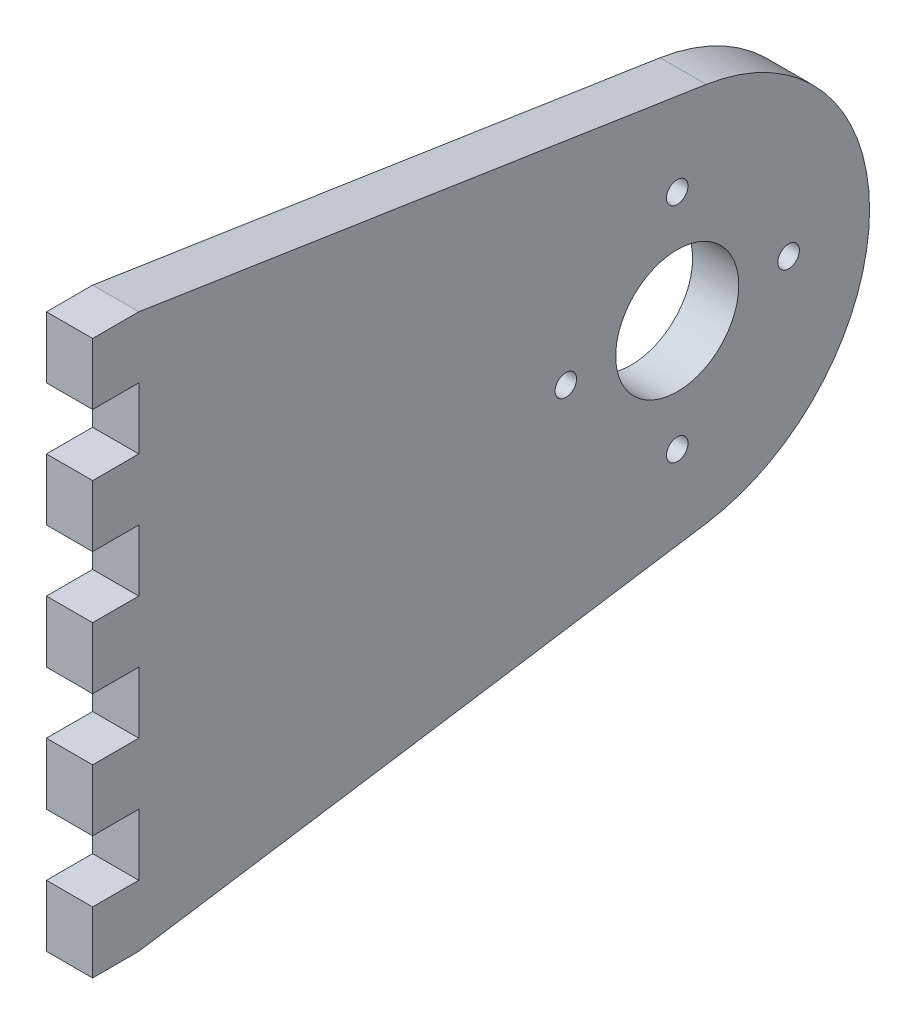
ISO-10303-21;
HEADER;
FILE_DESCRIPTION(('STEP AP214'),'2;1');
FILE_NAME('part.step','',(''),(''),'','','');
FILE_SCHEMA(('AUTOMOTIVE_DESIGN { 1 0 10303 214 1 1 1 1 }'));
ENDSEC;
DATA;
#1=APPLICATION_CONTEXT('core data for automotive mechanical design processes');
#2=APPLICATION_PROTOCOL_DEFINITION('international standard','automotive_design',2000,#1);
#3=PRODUCT_CONTEXT('',#1,'mechanical');
#4=PRODUCT('Part','Part','',(#3));
#5=PRODUCT_RELATED_PRODUCT_CATEGORY('part','',(#4));
#6=PRODUCT_DEFINITION_FORMATION('','',#4);
#7=PRODUCT_DEFINITION_CONTEXT('part definition',#1,'design');
#8=PRODUCT_DEFINITION('design','',#6,#7);
#9=PRODUCT_DEFINITION_SHAPE('','',#8);
#10=(LENGTH_UNIT() NAMED_UNIT(*) SI_UNIT(.MILLI.,.METRE.));
#11=(NAMED_UNIT(*) PLANE_ANGLE_UNIT() SI_UNIT($,.RADIAN.));
#12=(NAMED_UNIT(*) SI_UNIT($,.STERADIAN.) SOLID_ANGLE_UNIT());
#13=UNCERTAINTY_MEASURE_WITH_UNIT(LENGTH_MEASURE(1.E-05),#10,'distance_accuracy_value','');
#14=(GEOMETRIC_REPRESENTATION_CONTEXT(3) GLOBAL_UNCERTAINTY_ASSIGNED_CONTEXT((#13)) GLOBAL_UNIT_ASSIGNED_CONTEXT((#10,
#11,#12)) REPRESENTATION_CONTEXT('',''));
#15=CARTESIAN_POINT('',(0.,0.,0.));
#16=DIRECTION('',(0.,0.,1.));
#17=DIRECTION('',(1.,0.,0.));
#18=AXIS2_PLACEMENT_3D('',#15,#16,#17);
#19=CARTESIAN_POINT('',(3.,0.,0.));
#20=DIRECTION('',(1.,0.,0.));
#21=DIRECTION('',(0.,0.,-1.));
#22=AXIS2_PLACEMENT_3D('',#19,#20,#21);
#23=PLANE('',#22);
#24=CARTESIAN_POINT('',(3.,0.,-7.24));
#25=DIRECTION('',(1.,0.,0.));
#26=DIRECTION('',(0.,0.,-1.));
#27=AXIS2_PLACEMENT_3D('',#24,#25,#26);
#28=CIRCLE('',#27,0.700000000000001);
#29=CARTESIAN_POINT('',(3.,0.,-7.94));
#30=VERTEX_POINT('',#29);
#31=EDGE_CURVE('E426',#30,#30,#28,.T.);
#32=ORIENTED_EDGE('',*,*,#31,.F.);
#33=EDGE_LOOP('',(#32));
#34=FACE_BOUND('',#33,.T.);
#35=CARTESIAN_POINT('',(3.,0.,7.24));
#36=DIRECTION('',(1.,0.,0.));
#37=DIRECTION('',(0.,0.,-1.));
#38=AXIS2_PLACEMENT_3D('',#35,#36,#37);
#39=CIRCLE('',#38,0.7);
#40=CARTESIAN_POINT('',(3.,0.,6.54));
#41=VERTEX_POINT('',#40);
#42=EDGE_CURVE('E438',#41,#41,#39,.T.);
#43=ORIENTED_EDGE('',*,*,#42,.F.);
#44=EDGE_LOOP('',(#43));
#45=FACE_BOUND('',#44,.T.);
#46=DIRECTION('',(0.,0.,-1.));
#47=VECTOR('',#46,1.);
#48=CARTESIAN_POINT('',(3.,14.,38.));
#49=LINE('',#48,#47);
#50=CARTESIAN_POINT('',(3.,14.,38.));
#51=VERTEX_POINT('',#50);
#52=CARTESIAN_POINT('',(3.,14.,35.));
#53=VERTEX_POINT('',#52);
#54=EDGE_CURVE('E257',#51,#53,#49,.T.);
#55=ORIENTED_EDGE('',*,*,#54,.T.);
#56=DIRECTION('',(0.,-1.,0.));
#57=VECTOR('',#56,1.);
#58=CARTESIAN_POINT('',(3.,14.,35.));
#59=LINE('',#58,#57);
#60=CARTESIAN_POINT('',(3.,10.,35.));
#61=VERTEX_POINT('',#60);
#62=EDGE_CURVE('E135',#53,#61,#59,.T.);
#63=ORIENTED_EDGE('',*,*,#62,.T.);
#64=DIRECTION('',(0.,0.,1.));
#65=VECTOR('',#64,1.);
#66=CARTESIAN_POINT('',(3.,10.,35.));
#67=LINE('',#66,#65);
#68=CARTESIAN_POINT('',(3.,10.,38.));
#69=VERTEX_POINT('',#68);
#70=EDGE_CURVE('E314',#61,#69,#67,.T.);
#71=ORIENTED_EDGE('',*,*,#70,.T.);
#72=DIRECTION('',(0.,-1.,0.));
#73=VECTOR('',#72,1.);
#74=CARTESIAN_POINT('',(3.,10.,38.));
#75=LINE('',#74,#73);
#76=CARTESIAN_POINT('',(3.,6.,38.));
#77=VERTEX_POINT('',#76);
#78=EDGE_CURVE('E333',#69,#77,#75,.T.);
#79=ORIENTED_EDGE('',*,*,#78,.T.);
#80=DIRECTION('',(0.,0.,-1.));
#81=VECTOR('',#80,1.);
#82=CARTESIAN_POINT('',(3.,6.,38.));
#83=LINE('',#82,#81);
#84=CARTESIAN_POINT('',(3.,6.,35.));
#85=VERTEX_POINT('',#84);
#86=EDGE_CURVE('E330',#77,#85,#83,.T.);
#87=ORIENTED_EDGE('',*,*,#86,.T.);
#88=DIRECTION('',(0.,-1.,0.));
#89=VECTOR('',#88,1.);
#90=CARTESIAN_POINT('',(3.,6.,35.));
#91=LINE('',#90,#89);
#92=CARTESIAN_POINT('',(3.,2.,35.));
#93=VERTEX_POINT('',#92);
#94=EDGE_CURVE('E332',#85,#93,#91,.T.);
#95=ORIENTED_EDGE('',*,*,#94,.T.);
#96=DIRECTION('',(0.,0.,1.));
#97=VECTOR('',#96,1.);
#98=CARTESIAN_POINT('',(3.,2.,35.));
#99=LINE('',#98,#97);
#100=CARTESIAN_POINT('',(3.,2.,38.));
#101=VERTEX_POINT('',#100);
#102=EDGE_CURVE('E335',#93,#101,#99,.T.);
#103=ORIENTED_EDGE('',*,*,#102,.T.);
#104=DIRECTION('',(0.,-1.,0.));
#105=VECTOR('',#104,1.);
#106=CARTESIAN_POINT('',(3.,2.,38.));
#107=LINE('',#106,#105);
#108=CARTESIAN_POINT('',(3.,-2.,38.));
#109=VERTEX_POINT('',#108);
#110=EDGE_CURVE('E341',#101,#109,#107,.T.);
#111=ORIENTED_EDGE('',*,*,#110,.T.);
#112=DIRECTION('',(0.,0.,-1.));
#113=VECTOR('',#112,1.);
#114=CARTESIAN_POINT('',(3.,-2.,35.));
#115=LINE('',#114,#113);
#116=CARTESIAN_POINT('',(3.,-2.,35.));
#117=VERTEX_POINT('',#116);
#118=EDGE_CURVE('E343',#109,#117,#115,.T.);
#119=ORIENTED_EDGE('',*,*,#118,.T.);
#120=DIRECTION('',(0.,-1.,0.));
#121=VECTOR('',#120,1.);
#122=CARTESIAN_POINT('',(3.,-6.,35.));
#123=LINE('',#122,#121);
#124=CARTESIAN_POINT('',(3.,-6.,35.));
#125=VERTEX_POINT('',#124);
#126=EDGE_CURVE('E345',#117,#125,#123,.T.);
#127=ORIENTED_EDGE('',*,*,#126,.T.);
#128=DIRECTION('',(0.,0.,1.));
#129=VECTOR('',#128,1.);
#130=CARTESIAN_POINT('',(3.,-6.,38.));
#131=LINE('',#130,#129);
#132=CARTESIAN_POINT('',(3.,-6.,38.));
#133=VERTEX_POINT('',#132);
#134=EDGE_CURVE('E347',#125,#133,#131,.T.);
#135=ORIENTED_EDGE('',*,*,#134,.T.);
#136=DIRECTION('',(0.,-1.,0.));
#137=VECTOR('',#136,1.);
#138=CARTESIAN_POINT('',(3.,-6.,38.));
#139=LINE('',#138,#137);
#140=CARTESIAN_POINT('',(3.,-10.,38.));
#141=VERTEX_POINT('',#140);
#142=EDGE_CURVE('E349',#133,#141,#139,.T.);
#143=ORIENTED_EDGE('',*,*,#142,.T.);
#144=DIRECTION('',(0.,0.,-1.));
#145=VECTOR('',#144,1.);
#146=CARTESIAN_POINT('',(3.,-10.,35.));
#147=LINE('',#146,#145);
#148=CARTESIAN_POINT('',(3.,-10.,35.));
#149=VERTEX_POINT('',#148);
#150=EDGE_CURVE('E351',#141,#149,#147,.T.);
#151=ORIENTED_EDGE('',*,*,#150,.T.);
#152=DIRECTION('',(0.,-1.,0.));
#153=VECTOR('',#152,1.);
#154=CARTESIAN_POINT('',(3.,-14.,35.));
#155=LINE('',#154,#153);
#156=CARTESIAN_POINT('',(3.,-14.,35.));
#157=VERTEX_POINT('',#156);
#158=EDGE_CURVE('E353',#149,#157,#155,.T.);
#159=ORIENTED_EDGE('',*,*,#158,.T.);
#160=DIRECTION('',(0.,0.,1.));
#161=VECTOR('',#160,1.);
#162=CARTESIAN_POINT('',(3.,-14.,38.));
#163=LINE('',#162,#161);
#164=CARTESIAN_POINT('',(3.,-14.,38.));
#165=VERTEX_POINT('',#164);
#166=EDGE_CURVE('E355',#157,#165,#163,.T.);
#167=ORIENTED_EDGE('',*,*,#166,.T.);
#168=DIRECTION('',(0.,-1.,0.));
#169=VECTOR('',#168,1.);
#170=CARTESIAN_POINT('',(3.,-14.,38.));
#171=LINE('',#170,#169);
#172=CARTESIAN_POINT('',(3.,-18.,38.));
#173=VERTEX_POINT('',#172);
#174=EDGE_CURVE('E357',#165,#173,#171,.T.);
#175=ORIENTED_EDGE('',*,*,#174,.T.);
#176=DIRECTION('',(0.,0.,-1.));
#177=VECTOR('',#176,1.);
#178=CARTESIAN_POINT('',(3.,-18.,38.));
#179=LINE('',#178,#177);
#180=CARTESIAN_POINT('',(3.,-18.,35.));
#181=VERTEX_POINT('',#180);
#182=EDGE_CURVE('E359',#173,#181,#179,.T.);
#183=ORIENTED_EDGE('',*,*,#182,.T.);
#184=DIRECTION('',(0.,0.151228009328428,-0.988498907027499));
#185=VECTOR('',#184,1.);
#186=CARTESIAN_POINT('',(3.,-18.,35.));
#187=LINE('',#186,#185);
#188=CARTESIAN_POINT('',(3.,-12.3562363378437,-1.89035011660535));
#189=VERTEX_POINT('',#188);
#190=EDGE_CURVE('E361',#181,#189,#187,.T.);
#191=ORIENTED_EDGE('',*,*,#190,.T.);
#192=CARTESIAN_POINT('',(3.,0.,0.));
#193=DIRECTION('',(1.,0.,0.));
#194=DIRECTION('',(0.,0.,-1.));
#195=AXIS2_PLACEMENT_3D('',#192,#193,#194);
#196=CIRCLE('',#195,12.5);
#197=CARTESIAN_POINT('',(3.,12.3562363378437,-1.89035011660535));
#198=VERTEX_POINT('',#197);
#199=EDGE_CURVE('E196',#189,#198,#196,.T.);
#200=ORIENTED_EDGE('',*,*,#199,.T.);
#201=DIRECTION('',(0.,0.151228009328428,0.988498907027499));
#202=VECTOR('',#201,1.);
#203=CARTESIAN_POINT('',(3.,18.,35.));
#204=LINE('',#203,#202);
#205=CARTESIAN_POINT('',(3.,18.,35.));
#206=VERTEX_POINT('',#205);
#207=EDGE_CURVE('E190',#198,#206,#204,.T.);
#208=ORIENTED_EDGE('',*,*,#207,.T.);
#209=DIRECTION('',(0.,0.,1.));
#210=VECTOR('',#209,1.);
#211=CARTESIAN_POINT('',(3.,18.,38.));
#212=LINE('',#211,#210);
#213=CARTESIAN_POINT('',(3.,18.,38.));
#214=VERTEX_POINT('',#213);
#215=EDGE_CURVE('E194',#206,#214,#212,.T.);
#216=ORIENTED_EDGE('',*,*,#215,.T.);
#217=DIRECTION('',(0.,-1.,0.));
#218=VECTOR('',#217,1.);
#219=CARTESIAN_POINT('',(3.,18.,38.));
#220=LINE('',#219,#218);
#221=EDGE_CURVE('E50',#214,#51,#220,.T.);
#222=ORIENTED_EDGE('',*,*,#221,.T.);
#223=EDGE_LOOP('',(#55,#63,#71,#79,#87,#95,#103,#111,#119,#127,#135,#143,#151,#159,#167,#175,
#183,#191,#200,#208,#216,#222));
#224=FACE_BOUND('',#223,.T.);
#225=CARTESIAN_POINT('',(3.,0.,0.));
#226=DIRECTION('',(1.,0.,0.));
#227=DIRECTION('',(0.,0.,-1.));
#228=AXIS2_PLACEMENT_3D('',#225,#226,#227);
#229=CIRCLE('',#228,4.);
#230=CARTESIAN_POINT('',(3.,0.,-4.));
#231=VERTEX_POINT('',#230);
#232=EDGE_CURVE('E218',#231,#231,#229,.T.);
#233=ORIENTED_EDGE('',*,*,#232,.F.);
#234=EDGE_LOOP('',(#233));
#235=FACE_BOUND('',#234,.T.);
#236=CARTESIAN_POINT('',(3.,7.24,0.));
#237=DIRECTION('',(1.,0.,0.));
#238=DIRECTION('',(0.,0.,-1.));
#239=AXIS2_PLACEMENT_3D('',#236,#237,#238);
#240=CIRCLE('',#239,0.7);
#241=CARTESIAN_POINT('',(3.,7.24,-0.699999999999999));
#242=VERTEX_POINT('',#241);
#243=EDGE_CURVE('E432',#242,#242,#240,.T.);
#244=ORIENTED_EDGE('',*,*,#243,.F.);
#245=EDGE_LOOP('',(#244));
#246=FACE_BOUND('',#245,.T.);
#247=CARTESIAN_POINT('',(3.,-7.24,0.));
#248=DIRECTION('',(1.,0.,0.));
#249=DIRECTION('',(0.,0.,-1.));
#250=AXIS2_PLACEMENT_3D('',#247,#248,#249);
#251=CIRCLE('',#250,0.7);
#252=CARTESIAN_POINT('',(3.,-7.24,-0.700000000000001));
#253=VERTEX_POINT('',#252);
#254=EDGE_CURVE('E417',#253,#253,#251,.T.);
#255=ORIENTED_EDGE('',*,*,#254,.F.);
#256=EDGE_LOOP('',(#255));
#257=FACE_BOUND('',#256,.T.);
#258=ADVANCED_FACE('F33',(#34,#45,#224,#235,#246,#257),#23,.T.);
#259=CARTESIAN_POINT('',(0.,0.,0.));
#260=DIRECTION('',(1.,0.,0.));
#261=DIRECTION('',(0.,0.,-1.));
#262=AXIS2_PLACEMENT_3D('',#259,#260,#261);
#263=PLANE('',#262);
#264=CARTESIAN_POINT('',(0.,0.,-7.24));
#265=DIRECTION('',(1.,0.,0.));
#266=DIRECTION('',(0.,0.,-1.));
#267=AXIS2_PLACEMENT_3D('',#264,#265,#266);
#268=CIRCLE('',#267,0.700000000000001);
#269=CARTESIAN_POINT('',(0.,0.,-7.94));
#270=VERTEX_POINT('',#269);
#271=EDGE_CURVE('E423',#270,#270,#268,.T.);
#272=ORIENTED_EDGE('',*,*,#271,.T.);
#273=EDGE_LOOP('',(#272));
#274=FACE_BOUND('',#273,.T.);
#275=CARTESIAN_POINT('',(0.,0.,7.24));
#276=DIRECTION('',(1.,0.,0.));
#277=DIRECTION('',(0.,0.,-1.));
#278=AXIS2_PLACEMENT_3D('',#275,#276,#277);
#279=CIRCLE('',#278,0.7);
#280=CARTESIAN_POINT('',(0.,0.,6.54));
#281=VERTEX_POINT('',#280);
#282=EDGE_CURVE('E435',#281,#281,#279,.T.);
#283=ORIENTED_EDGE('',*,*,#282,.T.);
#284=EDGE_LOOP('',(#283));
#285=FACE_BOUND('',#284,.T.);
#286=DIRECTION('',(0.,0.,-1.));
#287=VECTOR('',#286,1.);
#288=CARTESIAN_POINT('',(0.,14.,38.));
#289=LINE('',#288,#287);
#290=CARTESIAN_POINT('',(0.,14.,38.));
#291=VERTEX_POINT('',#290);
#292=CARTESIAN_POINT('',(0.,14.,35.));
#293=VERTEX_POINT('',#292);
#294=EDGE_CURVE('E214',#291,#293,#289,.T.);
#295=ORIENTED_EDGE('',*,*,#294,.F.);
#296=DIRECTION('',(0.,-1.,0.));
#297=VECTOR('',#296,1.);
#298=CARTESIAN_POINT('',(0.,18.,38.));
#299=LINE('',#298,#297);
#300=CARTESIAN_POINT('',(0.,18.,38.));
#301=VERTEX_POINT('',#300);
#302=EDGE_CURVE('E127',#301,#291,#299,.T.);
#303=ORIENTED_EDGE('',*,*,#302,.F.);
#304=DIRECTION('',(0.,0.,1.));
#305=VECTOR('',#304,1.);
#306=CARTESIAN_POINT('',(0.,18.,38.));
#307=LINE('',#306,#305);
#308=CARTESIAN_POINT('',(0.,18.,35.));
#309=VERTEX_POINT('',#308);
#310=EDGE_CURVE('E121',#309,#301,#307,.T.);
#311=ORIENTED_EDGE('',*,*,#310,.F.);
#312=DIRECTION('',(0.,0.151228009328428,0.988498907027499));
#313=VECTOR('',#312,1.);
#314=CARTESIAN_POINT('',(0.,18.,35.));
#315=LINE('',#314,#313);
#316=CARTESIAN_POINT('',(0.,12.3562363378437,-1.89035011660535));
#317=VERTEX_POINT('',#316);
#318=EDGE_CURVE('E204',#317,#309,#315,.T.);
#319=ORIENTED_EDGE('',*,*,#318,.F.);
#320=CARTESIAN_POINT('',(0.,0.,0.));
#321=DIRECTION('',(1.,0.,0.));
#322=DIRECTION('',(0.,0.,-1.));
#323=AXIS2_PLACEMENT_3D('',#320,#321,#322);
#324=CIRCLE('',#323,12.5);
#325=CARTESIAN_POINT('',(0.,-12.3562363378437,-1.89035011660535));
#326=VERTEX_POINT('',#325);
#327=EDGE_CURVE('E252',#326,#317,#324,.T.);
#328=ORIENTED_EDGE('',*,*,#327,.F.);
#329=DIRECTION('',(0.,0.151228009328428,-0.988498907027499));
#330=VECTOR('',#329,1.);
#331=CARTESIAN_POINT('',(0.,-18.,35.));
#332=LINE('',#331,#330);
#333=CARTESIAN_POINT('',(0.,-18.,35.));
#334=VERTEX_POINT('',#333);
#335=EDGE_CURVE('E250',#334,#326,#332,.T.);
#336=ORIENTED_EDGE('',*,*,#335,.F.);
#337=DIRECTION('',(0.,0.,-1.));
#338=VECTOR('',#337,1.);
#339=CARTESIAN_POINT('',(0.,-18.,38.));
#340=LINE('',#339,#338);
#341=CARTESIAN_POINT('',(0.,-18.,38.));
#342=VERTEX_POINT('',#341);
#343=EDGE_CURVE('E248',#342,#334,#340,.T.);
#344=ORIENTED_EDGE('',*,*,#343,.F.);
#345=DIRECTION('',(0.,-1.,0.));
#346=VECTOR('',#345,1.);
#347=CARTESIAN_POINT('',(0.,-14.,38.));
#348=LINE('',#347,#346);
#349=CARTESIAN_POINT('',(0.,-14.,38.));
#350=VERTEX_POINT('',#349);
#351=EDGE_CURVE('E246',#350,#342,#348,.T.);
#352=ORIENTED_EDGE('',*,*,#351,.F.);
#353=DIRECTION('',(0.,0.,1.));
#354=VECTOR('',#353,1.);
#355=CARTESIAN_POINT('',(0.,-14.,38.));
#356=LINE('',#355,#354);
#357=CARTESIAN_POINT('',(0.,-14.,35.));
#358=VERTEX_POINT('',#357);
#359=EDGE_CURVE('E244',#358,#350,#356,.T.);
#360=ORIENTED_EDGE('',*,*,#359,.F.);
#361=DIRECTION('',(0.,-1.,0.));
#362=VECTOR('',#361,1.);
#363=CARTESIAN_POINT('',(0.,-14.,35.));
#364=LINE('',#363,#362);
#365=CARTESIAN_POINT('',(0.,-10.,35.));
#366=VERTEX_POINT('',#365);
#367=EDGE_CURVE('E242',#366,#358,#364,.T.);
#368=ORIENTED_EDGE('',*,*,#367,.F.);
#369=DIRECTION('',(0.,0.,-1.));
#370=VECTOR('',#369,1.);
#371=CARTESIAN_POINT('',(0.,-10.,35.));
#372=LINE('',#371,#370);
#373=CARTESIAN_POINT('',(0.,-10.,38.));
#374=VERTEX_POINT('',#373);
#375=EDGE_CURVE('E240',#374,#366,#372,.T.);
#376=ORIENTED_EDGE('',*,*,#375,.F.);
#377=DIRECTION('',(0.,-1.,0.));
#378=VECTOR('',#377,1.);
#379=CARTESIAN_POINT('',(0.,-6.,38.));
#380=LINE('',#379,#378);
#381=CARTESIAN_POINT('',(0.,-6.,38.));
#382=VERTEX_POINT('',#381);
#383=EDGE_CURVE('E238',#382,#374,#380,.T.);
#384=ORIENTED_EDGE('',*,*,#383,.F.);
#385=DIRECTION('',(0.,0.,1.));
#386=VECTOR('',#385,1.);
#387=CARTESIAN_POINT('',(0.,-6.,38.));
#388=LINE('',#387,#386);
#389=CARTESIAN_POINT('',(0.,-6.,35.));
#390=VERTEX_POINT('',#389);
#391=EDGE_CURVE('E236',#390,#382,#388,.T.);
#392=ORIENTED_EDGE('',*,*,#391,.F.);
#393=DIRECTION('',(0.,-1.,0.));
#394=VECTOR('',#393,1.);
#395=CARTESIAN_POINT('',(0.,-6.,35.));
#396=LINE('',#395,#394);
#397=CARTESIAN_POINT('',(0.,-2.,35.));
#398=VERTEX_POINT('',#397);
#399=EDGE_CURVE('E234',#398,#390,#396,.T.);
#400=ORIENTED_EDGE('',*,*,#399,.F.);
#401=DIRECTION('',(0.,0.,-1.));
#402=VECTOR('',#401,1.);
#403=CARTESIAN_POINT('',(0.,-2.,35.));
#404=LINE('',#403,#402);
#405=CARTESIAN_POINT('',(0.,-2.,38.));
#406=VERTEX_POINT('',#405);
#407=EDGE_CURVE('E232',#406,#398,#404,.T.);
#408=ORIENTED_EDGE('',*,*,#407,.F.);
#409=DIRECTION('',(0.,-1.,0.));
#410=VECTOR('',#409,1.);
#411=CARTESIAN_POINT('',(0.,2.,38.));
#412=LINE('',#411,#410);
#413=CARTESIAN_POINT('',(0.,2.,38.));
#414=VERTEX_POINT('',#413);
#415=EDGE_CURVE('E230',#414,#406,#412,.T.);
#416=ORIENTED_EDGE('',*,*,#415,.F.);
#417=DIRECTION('',(0.,0.,1.));
#418=VECTOR('',#417,1.);
#419=CARTESIAN_POINT('',(0.,2.,35.));
#420=LINE('',#419,#418);
#421=CARTESIAN_POINT('',(0.,2.,35.));
#422=VERTEX_POINT('',#421);
#423=EDGE_CURVE('E228',#422,#414,#420,.T.);
#424=ORIENTED_EDGE('',*,*,#423,.F.);
#425=DIRECTION('',(0.,-1.,0.));
#426=VECTOR('',#425,1.);
#427=CARTESIAN_POINT('',(0.,6.,35.));
#428=LINE('',#427,#426);
#429=CARTESIAN_POINT('',(0.,6.,35.));
#430=VERTEX_POINT('',#429);
#431=EDGE_CURVE('E226',#430,#422,#428,.T.);
#432=ORIENTED_EDGE('',*,*,#431,.F.);
#433=DIRECTION('',(0.,0.,-1.));
#434=VECTOR('',#433,1.);
#435=CARTESIAN_POINT('',(0.,6.,38.));
#436=LINE('',#435,#434);
#437=CARTESIAN_POINT('',(0.,6.,38.));
#438=VERTEX_POINT('',#437);
#439=EDGE_CURVE('E224',#438,#430,#436,.T.);
#440=ORIENTED_EDGE('',*,*,#439,.F.);
#441=DIRECTION('',(0.,-1.,0.));
#442=VECTOR('',#441,1.);
#443=CARTESIAN_POINT('',(0.,10.,38.));
#444=LINE('',#443,#442);
#445=CARTESIAN_POINT('',(0.,10.,38.));
#446=VERTEX_POINT('',#445);
#447=EDGE_CURVE('E222',#446,#438,#444,.T.);
#448=ORIENTED_EDGE('',*,*,#447,.F.);
#449=DIRECTION('',(0.,0.,1.));
#450=VECTOR('',#449,1.);
#451=CARTESIAN_POINT('',(0.,10.,35.));
#452=LINE('',#451,#450);
#453=CARTESIAN_POINT('',(0.,10.,35.));
#454=VERTEX_POINT('',#453);
#455=EDGE_CURVE('E220',#454,#446,#452,.T.);
#456=ORIENTED_EDGE('',*,*,#455,.F.);
#457=DIRECTION('',(0.,-1.,0.));
#458=VECTOR('',#457,1.);
#459=CARTESIAN_POINT('',(0.,14.,35.));
#460=LINE('',#459,#458);
#461=EDGE_CURVE('E217',#293,#454,#460,.T.);
#462=ORIENTED_EDGE('',*,*,#461,.F.);
#463=EDGE_LOOP('',(#295,#303,#311,#319,#328,#336,#344,#352,#360,#368,#376,#384,#392,#400,#408,
#416,#424,#432,#440,#448,#456,#462));
#464=FACE_BOUND('',#463,.T.);
#465=CARTESIAN_POINT('',(0.,0.,0.));
#466=DIRECTION('',(1.,0.,0.));
#467=DIRECTION('',(0.,0.,-1.));
#468=AXIS2_PLACEMENT_3D('',#465,#466,#467);
#469=CIRCLE('',#468,4.);
#470=CARTESIAN_POINT('',(0.,0.,-4.));
#471=VERTEX_POINT('',#470);
#472=EDGE_CURVE('E441',#471,#471,#469,.T.);
#473=ORIENTED_EDGE('',*,*,#472,.T.);
#474=EDGE_LOOP('',(#473));
#475=FACE_BOUND('',#474,.T.);
#476=CARTESIAN_POINT('',(0.,7.24,0.));
#477=DIRECTION('',(1.,0.,0.));
#478=DIRECTION('',(0.,0.,-1.));
#479=AXIS2_PLACEMENT_3D('',#476,#477,#478);
#480=CIRCLE('',#479,0.7);
#481=CARTESIAN_POINT('',(0.,7.24,-0.699999999999999));
#482=VERTEX_POINT('',#481);
#483=EDGE_CURVE('E429',#482,#482,#480,.T.);
#484=ORIENTED_EDGE('',*,*,#483,.T.);
#485=EDGE_LOOP('',(#484));
#486=FACE_BOUND('',#485,.T.);
#487=CARTESIAN_POINT('',(0.,-7.24,0.));
#488=DIRECTION('',(1.,0.,0.));
#489=DIRECTION('',(0.,0.,-1.));
#490=AXIS2_PLACEMENT_3D('',#487,#488,#489);
#491=CIRCLE('',#490,0.7);
#492=CARTESIAN_POINT('',(0.,-7.24,-0.700000000000001));
#493=VERTEX_POINT('',#492);
#494=EDGE_CURVE('E420',#493,#493,#491,.T.);
#495=ORIENTED_EDGE('',*,*,#494,.T.);
#496=EDGE_LOOP('',(#495));
#497=FACE_BOUND('',#496,.T.);
#498=ADVANCED_FACE('F318',(#274,#285,#464,#475,#486,#497),#263,.F.);
#499=CARTESIAN_POINT('',(3.,14.,38.));
#500=DIRECTION('',(0.,1.,0.));
#501=DIRECTION('',(0.,0.,1.));
#502=AXIS2_PLACEMENT_3D('',#499,#500,#501);
#503=PLANE('',#502);
#504=ORIENTED_EDGE('',*,*,#294,.T.);
#505=DIRECTION('',(-1.,0.,0.));
#506=VECTOR('',#505,1.);
#507=CARTESIAN_POINT('',(3.,14.,35.));
#508=LINE('',#507,#506);
#509=EDGE_CURVE('E11',#53,#293,#508,.T.);
#510=ORIENTED_EDGE('',*,*,#509,.F.);
#511=ORIENTED_EDGE('',*,*,#54,.F.);
#512=DIRECTION('',(-1.,0.,0.));
#513=VECTOR('',#512,1.);
#514=CARTESIAN_POINT('',(3.,14.,38.));
#515=LINE('',#514,#513);
#516=EDGE_CURVE('E210',#51,#291,#515,.T.);
#517=ORIENTED_EDGE('',*,*,#516,.T.);
#518=EDGE_LOOP('',(#504,#510,#511,#517));
#519=FACE_BOUND('',#518,.T.);
#520=ADVANCED_FACE('F35',(#519),#503,.F.);
#521=CARTESIAN_POINT('',(3.,14.,35.));
#522=DIRECTION('',(0.,0.,-1.));
#523=DIRECTION('',(-1.,0.,0.));
#524=AXIS2_PLACEMENT_3D('',#521,#522,#523);
#525=PLANE('',#524);
#526=ORIENTED_EDGE('',*,*,#461,.T.);
#527=DIRECTION('',(-1.,0.,0.));
#528=VECTOR('',#527,1.);
#529=CARTESIAN_POINT('',(3.,10.,35.));
#530=LINE('',#529,#528);
#531=EDGE_CURVE('E42',#61,#454,#530,.T.);
#532=ORIENTED_EDGE('',*,*,#531,.F.);
#533=ORIENTED_EDGE('',*,*,#62,.F.);
#534=ORIENTED_EDGE('',*,*,#509,.T.);
#535=EDGE_LOOP('',(#526,#532,#533,#534));
#536=FACE_BOUND('',#535,.T.);
#537=ADVANCED_FACE('F659',(#536),#525,.F.);
#538=CARTESIAN_POINT('',(3.,10.,35.));
#539=DIRECTION('',(0.,-1.,0.));
#540=DIRECTION('',(0.,0.,-1.));
#541=AXIS2_PLACEMENT_3D('',#538,#539,#540);
#542=PLANE('',#541);
#543=ORIENTED_EDGE('',*,*,#455,.T.);
#544=DIRECTION('',(-1.,0.,0.));
#545=VECTOR('',#544,1.);
#546=CARTESIAN_POINT('',(3.,10.,38.));
#547=LINE('',#546,#545);
#548=EDGE_CURVE('E306',#69,#446,#547,.T.);
#549=ORIENTED_EDGE('',*,*,#548,.F.);
#550=ORIENTED_EDGE('',*,*,#70,.F.);
#551=ORIENTED_EDGE('',*,*,#531,.T.);
#552=EDGE_LOOP('',(#543,#549,#550,#551));
#553=FACE_BOUND('',#552,.T.);
#554=ADVANCED_FACE('F312',(#553),#542,.F.);
#555=CARTESIAN_POINT('',(3.,10.,38.));
#556=DIRECTION('',(0.,0.,-1.));
#557=DIRECTION('',(-1.,0.,0.));
#558=AXIS2_PLACEMENT_3D('',#555,#556,#557);
#559=PLANE('',#558);
#560=ORIENTED_EDGE('',*,*,#447,.T.);
#561=DIRECTION('',(-1.,0.,0.));
#562=VECTOR('',#561,1.);
#563=CARTESIAN_POINT('',(3.,6.,38.));
#564=LINE('',#563,#562);
#565=EDGE_CURVE('E303',#77,#438,#564,.T.);
#566=ORIENTED_EDGE('',*,*,#565,.F.);
#567=ORIENTED_EDGE('',*,*,#78,.F.);
#568=ORIENTED_EDGE('',*,*,#548,.T.);
#569=EDGE_LOOP('',(#560,#566,#567,#568));
#570=FACE_BOUND('',#569,.T.);
#571=ADVANCED_FACE('F324',(#570),#559,.F.);
#572=CARTESIAN_POINT('',(3.,6.,38.));
#573=DIRECTION('',(0.,1.,0.));
#574=DIRECTION('',(0.,0.,1.));
#575=AXIS2_PLACEMENT_3D('',#572,#573,#574);
#576=PLANE('',#575);
#577=ORIENTED_EDGE('',*,*,#439,.T.);
#578=DIRECTION('',(-1.,0.,0.));
#579=VECTOR('',#578,1.);
#580=CARTESIAN_POINT('',(3.,6.,35.));
#581=LINE('',#580,#579);
#582=EDGE_CURVE('E300',#85,#430,#581,.T.);
#583=ORIENTED_EDGE('',*,*,#582,.F.);
#584=ORIENTED_EDGE('',*,*,#86,.F.);
#585=ORIENTED_EDGE('',*,*,#565,.T.);
#586=EDGE_LOOP('',(#577,#583,#584,#585));
#587=FACE_BOUND('',#586,.T.);
#588=ADVANCED_FACE('F328',(#587),#576,.F.);
#589=CARTESIAN_POINT('',(3.,6.,35.));
#590=DIRECTION('',(0.,0.,-1.));
#591=DIRECTION('',(-1.,0.,0.));
#592=AXIS2_PLACEMENT_3D('',#589,#590,#591);
#593=PLANE('',#592);
#594=ORIENTED_EDGE('',*,*,#431,.T.);
#595=DIRECTION('',(-1.,0.,0.));
#596=VECTOR('',#595,1.);
#597=CARTESIAN_POINT('',(3.,2.,35.));
#598=LINE('',#597,#596);
#599=EDGE_CURVE('E297',#93,#422,#598,.T.);
#600=ORIENTED_EDGE('',*,*,#599,.F.);
#601=ORIENTED_EDGE('',*,*,#94,.F.);
#602=ORIENTED_EDGE('',*,*,#582,.T.);
#603=EDGE_LOOP('',(#594,#600,#601,#602));
#604=FACE_BOUND('',#603,.T.);
#605=ADVANCED_FACE('F624',(#604),#593,.F.);
#606=CARTESIAN_POINT('',(3.,2.,35.));
#607=DIRECTION('',(0.,-1.,0.));
#608=DIRECTION('',(0.,0.,-1.));
#609=AXIS2_PLACEMENT_3D('',#606,#607,#608);
#610=PLANE('',#609);
#611=ORIENTED_EDGE('',*,*,#423,.T.);
#612=DIRECTION('',(-1.,0.,0.));
#613=VECTOR('',#612,1.);
#614=CARTESIAN_POINT('',(3.,2.,38.));
#615=LINE('',#614,#613);
#616=EDGE_CURVE('E294',#101,#414,#615,.T.);
#617=ORIENTED_EDGE('',*,*,#616,.F.);
#618=ORIENTED_EDGE('',*,*,#102,.F.);
#619=ORIENTED_EDGE('',*,*,#599,.T.);
#620=EDGE_LOOP('',(#611,#617,#618,#619));
#621=FACE_BOUND('',#620,.T.);
#622=ADVANCED_FACE('F614',(#621),#610,.F.);
#623=CARTESIAN_POINT('',(3.,2.,38.));
#624=DIRECTION('',(0.,0.,-1.));
#625=DIRECTION('',(-1.,0.,0.));
#626=AXIS2_PLACEMENT_3D('',#623,#624,#625);
#627=PLANE('',#626);
#628=ORIENTED_EDGE('',*,*,#415,.T.);
#629=DIRECTION('',(-1.,0.,0.));
#630=VECTOR('',#629,1.);
#631=CARTESIAN_POINT('',(3.,-2.,38.));
#632=LINE('',#631,#630);
#633=EDGE_CURVE('E291',#109,#406,#632,.T.);
#634=ORIENTED_EDGE('',*,*,#633,.F.);
#635=ORIENTED_EDGE('',*,*,#110,.F.);
#636=ORIENTED_EDGE('',*,*,#616,.T.);
#637=EDGE_LOOP('',(#628,#634,#635,#636));
#638=FACE_BOUND('',#637,.T.);
#639=ADVANCED_FACE('F604',(#638),#627,.F.);
#640=CARTESIAN_POINT('',(3.,-2.,35.));
#641=DIRECTION('',(0.,1.,0.));
#642=DIRECTION('',(0.,0.,1.));
#643=AXIS2_PLACEMENT_3D('',#640,#641,#642);
#644=PLANE('',#643);
#645=ORIENTED_EDGE('',*,*,#407,.T.);
#646=DIRECTION('',(-1.,0.,0.));
#647=VECTOR('',#646,1.);
#648=CARTESIAN_POINT('',(3.,-2.,35.));
#649=LINE('',#648,#647);
#650=EDGE_CURVE('E288',#117,#398,#649,.T.);
#651=ORIENTED_EDGE('',*,*,#650,.F.);
#652=ORIENTED_EDGE('',*,*,#118,.F.);
#653=ORIENTED_EDGE('',*,*,#633,.T.);
#654=EDGE_LOOP('',(#645,#651,#652,#653));
#655=FACE_BOUND('',#654,.T.);
#656=ADVANCED_FACE('F594',(#655),#644,.F.);
#657=CARTESIAN_POINT('',(3.,-6.,35.));
#658=DIRECTION('',(0.,0.,-1.));
#659=DIRECTION('',(-1.,0.,0.));
#660=AXIS2_PLACEMENT_3D('',#657,#658,#659);
#661=PLANE('',#660);
#662=ORIENTED_EDGE('',*,*,#399,.T.);
#663=DIRECTION('',(-1.,0.,0.));
#664=VECTOR('',#663,1.);
#665=CARTESIAN_POINT('',(3.,-6.,35.));
#666=LINE('',#665,#664);
#667=EDGE_CURVE('E285',#125,#390,#666,.T.);
#668=ORIENTED_EDGE('',*,*,#667,.F.);
#669=ORIENTED_EDGE('',*,*,#126,.F.);
#670=ORIENTED_EDGE('',*,*,#650,.T.);
#671=EDGE_LOOP('',(#662,#668,#669,#670));
#672=FACE_BOUND('',#671,.T.);
#673=ADVANCED_FACE('F584',(#672),#661,.F.);
#674=CARTESIAN_POINT('',(3.,-6.,38.));
#675=DIRECTION('',(0.,-1.,0.));
#676=DIRECTION('',(0.,0.,-1.));
#677=AXIS2_PLACEMENT_3D('',#674,#675,#676);
#678=PLANE('',#677);
#679=ORIENTED_EDGE('',*,*,#391,.T.);
#680=DIRECTION('',(-1.,0.,0.));
#681=VECTOR('',#680,1.);
#682=CARTESIAN_POINT('',(3.,-6.,38.));
#683=LINE('',#682,#681);
#684=EDGE_CURVE('E282',#133,#382,#683,.T.);
#685=ORIENTED_EDGE('',*,*,#684,.F.);
#686=ORIENTED_EDGE('',*,*,#134,.F.);
#687=ORIENTED_EDGE('',*,*,#667,.T.);
#688=EDGE_LOOP('',(#679,#685,#686,#687));
#689=FACE_BOUND('',#688,.T.);
#690=ADVANCED_FACE('F574',(#689),#678,.F.);
#691=CARTESIAN_POINT('',(3.,-6.,38.));
#692=DIRECTION('',(0.,0.,-1.));
#693=DIRECTION('',(-1.,0.,0.));
#694=AXIS2_PLACEMENT_3D('',#691,#692,#693);
#695=PLANE('',#694);
#696=ORIENTED_EDGE('',*,*,#383,.T.);
#697=DIRECTION('',(-1.,0.,0.));
#698=VECTOR('',#697,1.);
#699=CARTESIAN_POINT('',(3.,-10.,38.));
#700=LINE('',#699,#698);
#701=EDGE_CURVE('E279',#141,#374,#700,.T.);
#702=ORIENTED_EDGE('',*,*,#701,.F.);
#703=ORIENTED_EDGE('',*,*,#142,.F.);
#704=ORIENTED_EDGE('',*,*,#684,.T.);
#705=EDGE_LOOP('',(#696,#702,#703,#704));
#706=FACE_BOUND('',#705,.T.);
#707=ADVANCED_FACE('F564',(#706),#695,.F.);
#708=CARTESIAN_POINT('',(3.,-10.,35.));
#709=DIRECTION('',(0.,1.,0.));
#710=DIRECTION('',(0.,0.,1.));
#711=AXIS2_PLACEMENT_3D('',#708,#709,#710);
#712=PLANE('',#711);
#713=ORIENTED_EDGE('',*,*,#375,.T.);
#714=DIRECTION('',(-1.,0.,0.));
#715=VECTOR('',#714,1.);
#716=CARTESIAN_POINT('',(3.,-10.,35.));
#717=LINE('',#716,#715);
#718=EDGE_CURVE('E276',#149,#366,#717,.T.);
#719=ORIENTED_EDGE('',*,*,#718,.F.);
#720=ORIENTED_EDGE('',*,*,#150,.F.);
#721=ORIENTED_EDGE('',*,*,#701,.T.);
#722=EDGE_LOOP('',(#713,#719,#720,#721));
#723=FACE_BOUND('',#722,.T.);
#724=ADVANCED_FACE('F554',(#723),#712,.F.);
#725=CARTESIAN_POINT('',(3.,-14.,35.));
#726=DIRECTION('',(0.,0.,-1.));
#727=DIRECTION('',(-1.,0.,0.));
#728=AXIS2_PLACEMENT_3D('',#725,#726,#727);
#729=PLANE('',#728);
#730=ORIENTED_EDGE('',*,*,#367,.T.);
#731=DIRECTION('',(-1.,0.,0.));
#732=VECTOR('',#731,1.);
#733=CARTESIAN_POINT('',(3.,-14.,35.));
#734=LINE('',#733,#732);
#735=EDGE_CURVE('E273',#157,#358,#734,.T.);
#736=ORIENTED_EDGE('',*,*,#735,.F.);
#737=ORIENTED_EDGE('',*,*,#158,.F.);
#738=ORIENTED_EDGE('',*,*,#718,.T.);
#739=EDGE_LOOP('',(#730,#736,#737,#738));
#740=FACE_BOUND('',#739,.T.);
#741=ADVANCED_FACE('F544',(#740),#729,.F.);
#742=CARTESIAN_POINT('',(3.,-14.,38.));
#743=DIRECTION('',(0.,-1.,0.));
#744=DIRECTION('',(0.,0.,-1.));
#745=AXIS2_PLACEMENT_3D('',#742,#743,#744);
#746=PLANE('',#745);
#747=ORIENTED_EDGE('',*,*,#359,.T.);
#748=DIRECTION('',(-1.,0.,0.));
#749=VECTOR('',#748,1.);
#750=CARTESIAN_POINT('',(3.,-14.,38.));
#751=LINE('',#750,#749);
#752=EDGE_CURVE('E270',#165,#350,#751,.T.);
#753=ORIENTED_EDGE('',*,*,#752,.F.);
#754=ORIENTED_EDGE('',*,*,#166,.F.);
#755=ORIENTED_EDGE('',*,*,#735,.T.);
#756=EDGE_LOOP('',(#747,#753,#754,#755));
#757=FACE_BOUND('',#756,.T.);
#758=ADVANCED_FACE('F534',(#757),#746,.F.);
#759=CARTESIAN_POINT('',(3.,-14.,38.));
#760=DIRECTION('',(0.,0.,-1.));
#761=DIRECTION('',(-1.,0.,0.));
#762=AXIS2_PLACEMENT_3D('',#759,#760,#761);
#763=PLANE('',#762);
#764=ORIENTED_EDGE('',*,*,#351,.T.);
#765=DIRECTION('',(-1.,0.,0.));
#766=VECTOR('',#765,1.);
#767=CARTESIAN_POINT('',(3.,-18.,38.));
#768=LINE('',#767,#766);
#769=EDGE_CURVE('E267',#173,#342,#768,.T.);
#770=ORIENTED_EDGE('',*,*,#769,.F.);
#771=ORIENTED_EDGE('',*,*,#174,.F.);
#772=ORIENTED_EDGE('',*,*,#752,.T.);
#773=EDGE_LOOP('',(#764,#770,#771,#772));
#774=FACE_BOUND('',#773,.T.);
#775=ADVANCED_FACE('F524',(#774),#763,.F.);
#776=CARTESIAN_POINT('',(3.,-18.,38.));
#777=DIRECTION('',(0.,1.,0.));
#778=DIRECTION('',(0.,0.,1.));
#779=AXIS2_PLACEMENT_3D('',#776,#777,#778);
#780=PLANE('',#779);
#781=ORIENTED_EDGE('',*,*,#343,.T.);
#782=DIRECTION('',(-1.,0.,0.));
#783=VECTOR('',#782,1.);
#784=CARTESIAN_POINT('',(3.,-18.,35.));
#785=LINE('',#784,#783);
#786=EDGE_CURVE('E264',#181,#334,#785,.T.);
#787=ORIENTED_EDGE('',*,*,#786,.F.);
#788=ORIENTED_EDGE('',*,*,#182,.F.);
#789=ORIENTED_EDGE('',*,*,#769,.T.);
#790=EDGE_LOOP('',(#781,#787,#788,#789));
#791=FACE_BOUND('',#790,.T.);
#792=ADVANCED_FACE('F515',(#791),#780,.F.);
#793=CARTESIAN_POINT('',(3.,-18.,35.));
#794=DIRECTION('',(0.,0.988498907027499,0.151228009328428));
#795=DIRECTION('',(0.,-0.151228009328428,0.9884989070275));
#796=AXIS2_PLACEMENT_3D('',#793,#794,#795);
#797=PLANE('',#796);
#798=ORIENTED_EDGE('',*,*,#335,.T.);
#799=DIRECTION('',(-1.,0.,0.));
#800=VECTOR('',#799,1.);
#801=CARTESIAN_POINT('',(3.,-12.3562363378437,-1.89035011660535));
#802=LINE('',#801,#800);
#803=EDGE_CURVE('E261',#189,#326,#802,.T.);
#804=ORIENTED_EDGE('',*,*,#803,.F.);
#805=ORIENTED_EDGE('',*,*,#190,.F.);
#806=ORIENTED_EDGE('',*,*,#786,.T.);
#807=EDGE_LOOP('',(#798,#804,#805,#806));
#808=FACE_BOUND('',#807,.T.);
#809=ADVANCED_FACE('F367',(#808),#797,.F.);
#810=CARTESIAN_POINT('',(3.,0.,0.));
#811=DIRECTION('',(-1.,0.,0.));
#812=DIRECTION('',(0.,0.,1.));
#813=AXIS2_PLACEMENT_3D('',#810,#811,#812);
#814=CYLINDRICAL_SURFACE('',#813,12.5);
#815=ORIENTED_EDGE('',*,*,#327,.T.);
#816=DIRECTION('',(-1.,0.,0.));
#817=VECTOR('',#816,1.);
#818=CARTESIAN_POINT('',(3.,12.3562363378437,-1.89035011660535));
#819=LINE('',#818,#817);
#820=EDGE_CURVE('E205',#198,#317,#819,.T.);
#821=ORIENTED_EDGE('',*,*,#820,.F.);
#822=ORIENTED_EDGE('',*,*,#199,.F.);
#823=ORIENTED_EDGE('',*,*,#803,.T.);
#824=EDGE_LOOP('',(#815,#821,#822,#823));
#825=FACE_BOUND('',#824,.T.);
#826=ADVANCED_FACE('F371',(#825),#814,.T.);
#827=CARTESIAN_POINT('',(3.,18.,35.));
#828=DIRECTION('',(0.,-0.988498907027499,0.151228009328428));
#829=DIRECTION('',(0.,-0.151228009328428,-0.9884989070275));
#830=AXIS2_PLACEMENT_3D('',#827,#828,#829);
#831=PLANE('',#830);
#832=ORIENTED_EDGE('',*,*,#318,.T.);
#833=DIRECTION('',(-1.,0.,0.));
#834=VECTOR('',#833,1.);
#835=CARTESIAN_POINT('',(3.,18.,35.));
#836=LINE('',#835,#834);
#837=EDGE_CURVE('E201',#206,#309,#836,.T.);
#838=ORIENTED_EDGE('',*,*,#837,.F.);
#839=ORIENTED_EDGE('',*,*,#207,.F.);
#840=ORIENTED_EDGE('',*,*,#820,.T.);
#841=EDGE_LOOP('',(#832,#838,#839,#840));
#842=FACE_BOUND('',#841,.T.);
#843=ADVANCED_FACE('F202',(#842),#831,.F.);
#844=CARTESIAN_POINT('',(3.,18.,38.));
#845=DIRECTION('',(0.,-1.,0.));
#846=DIRECTION('',(0.,0.,-1.));
#847=AXIS2_PLACEMENT_3D('',#844,#845,#846);
#848=PLANE('',#847);
#849=ORIENTED_EDGE('',*,*,#310,.T.);
#850=DIRECTION('',(-1.,0.,0.));
#851=VECTOR('',#850,1.);
#852=CARTESIAN_POINT('',(3.,18.,38.));
#853=LINE('',#852,#851);
#854=EDGE_CURVE('E206',#214,#301,#853,.T.);
#855=ORIENTED_EDGE('',*,*,#854,.F.);
#856=ORIENTED_EDGE('',*,*,#215,.F.);
#857=ORIENTED_EDGE('',*,*,#837,.T.);
#858=EDGE_LOOP('',(#849,#855,#856,#857));
#859=FACE_BOUND('',#858,.T.);
#860=ADVANCED_FACE('F208',(#859),#848,.F.);
#861=CARTESIAN_POINT('',(3.,18.,38.));
#862=DIRECTION('',(0.,0.,-1.));
#863=DIRECTION('',(-1.,0.,0.));
#864=AXIS2_PLACEMENT_3D('',#861,#862,#863);
#865=PLANE('',#864);
#866=ORIENTED_EDGE('',*,*,#302,.T.);
#867=ORIENTED_EDGE('',*,*,#516,.F.);
#868=ORIENTED_EDGE('',*,*,#221,.F.);
#869=ORIENTED_EDGE('',*,*,#854,.T.);
#870=EDGE_LOOP('',(#866,#867,#868,#869));
#871=FACE_BOUND('',#870,.T.);
#872=ADVANCED_FACE('F375',(#871),#865,.F.);
#873=CARTESIAN_POINT('',(3.,0.,0.));
#874=DIRECTION('',(-1.,0.,0.));
#875=DIRECTION('',(0.,0.,1.));
#876=AXIS2_PLACEMENT_3D('',#873,#874,#875);
#877=CYLINDRICAL_SURFACE('',#876,4.);
#878=ORIENTED_EDGE('',*,*,#232,.T.);
#879=EDGE_LOOP('',(#878));
#880=FACE_BOUND('',#879,.T.);
#881=ORIENTED_EDGE('',*,*,#472,.F.);
#882=EDGE_LOOP('',(#881));
#883=FACE_BOUND('',#882,.T.);
#884=ADVANCED_FACE('F377',(#880,#883),#877,.F.);
#885=CARTESIAN_POINT('',(3.,0.,7.24));
#886=DIRECTION('',(-1.,0.,0.));
#887=DIRECTION('',(0.,0.,1.));
#888=AXIS2_PLACEMENT_3D('',#885,#886,#887);
#889=CYLINDRICAL_SURFACE('',#888,0.7);
#890=ORIENTED_EDGE('',*,*,#42,.T.);
#891=EDGE_LOOP('',(#890));
#892=FACE_BOUND('',#891,.T.);
#893=ORIENTED_EDGE('',*,*,#282,.F.);
#894=EDGE_LOOP('',(#893));
#895=FACE_BOUND('',#894,.T.);
#896=ADVANCED_FACE('F383',(#892,#895),#889,.F.);
#897=CARTESIAN_POINT('',(3.,7.24,0.));
#898=DIRECTION('',(-1.,0.,0.));
#899=DIRECTION('',(0.,0.,1.));
#900=AXIS2_PLACEMENT_3D('',#897,#898,#899);
#901=CYLINDRICAL_SURFACE('',#900,0.7);
#902=ORIENTED_EDGE('',*,*,#243,.T.);
#903=EDGE_LOOP('',(#902));
#904=FACE_BOUND('',#903,.T.);
#905=ORIENTED_EDGE('',*,*,#483,.F.);
#906=EDGE_LOOP('',(#905));
#907=FACE_BOUND('',#906,.T.);
#908=ADVANCED_FACE('F400',(#904,#907),#901,.F.);
#909=CARTESIAN_POINT('',(3.,0.,-7.24));
#910=DIRECTION('',(-1.,0.,0.));
#911=DIRECTION('',(0.,0.,1.));
#912=AXIS2_PLACEMENT_3D('',#909,#910,#911);
#913=CYLINDRICAL_SURFACE('',#912,0.700000000000001);
#914=ORIENTED_EDGE('',*,*,#31,.T.);
#915=EDGE_LOOP('',(#914));
#916=FACE_BOUND('',#915,.T.);
#917=ORIENTED_EDGE('',*,*,#271,.F.);
#918=EDGE_LOOP('',(#917));
#919=FACE_BOUND('',#918,.T.);
#920=ADVANCED_FACE('F404',(#916,#919),#913,.F.);
#921=CARTESIAN_POINT('',(3.,-7.24,0.));
#922=DIRECTION('',(-1.,0.,0.));
#923=DIRECTION('',(0.,0.,1.));
#924=AXIS2_PLACEMENT_3D('',#921,#922,#923);
#925=CYLINDRICAL_SURFACE('',#924,0.7);
#926=ORIENTED_EDGE('',*,*,#254,.T.);
#927=EDGE_LOOP('',(#926));
#928=FACE_BOUND('',#927,.T.);
#929=ORIENTED_EDGE('',*,*,#494,.F.);
#930=EDGE_LOOP('',(#929));
#931=FACE_BOUND('',#930,.T.);
#932=ADVANCED_FACE('F408',(#928,#931),#925,.F.);
#933=CLOSED_SHELL('',(#258,#498,#520,#537,#554,#571,#588,#605,#622,#639,#656,#673,#690,#707,
#724,#741,#758,#775,#792,#809,#826,#843,#860,#872,#884,#896,#908,#920,#932));
#934=MANIFOLD_SOLID_BREP('B2',#933);
#935=ADVANCED_BREP_SHAPE_REPRESENTATION('',(#18,#934),#14);
#936=SHAPE_DEFINITION_REPRESENTATION(#9,#935);
ENDSEC;
END-ISO-10303-21;
